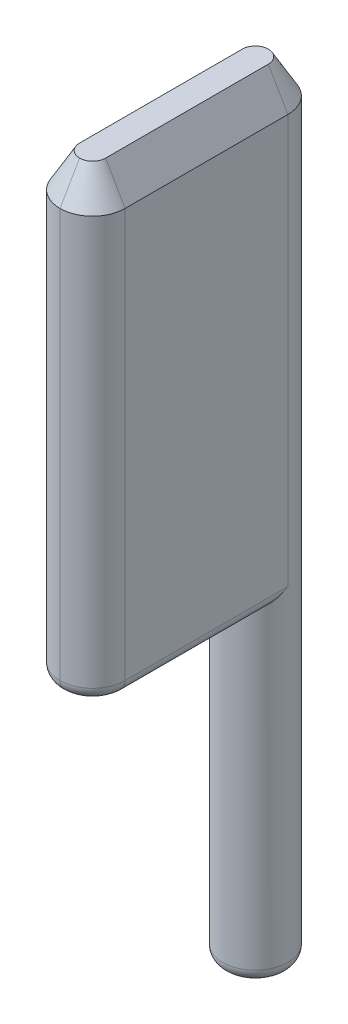
ISO-10303-21;
HEADER;
FILE_DESCRIPTION(('STEP AP214'),'2;1');
FILE_NAME('part.step','',(''),(''),'','','');
FILE_SCHEMA(('AUTOMOTIVE_DESIGN { 1 0 10303 214 1 1 1 1 }'));
ENDSEC;
DATA;
#1=APPLICATION_CONTEXT('core data for automotive mechanical design processes');
#2=APPLICATION_PROTOCOL_DEFINITION('international standard','automotive_design',2000,#1);
#3=PRODUCT_CONTEXT('',#1,'mechanical');
#4=PRODUCT('Part','Part','',(#3));
#5=PRODUCT_RELATED_PRODUCT_CATEGORY('part','',(#4));
#6=PRODUCT_DEFINITION_FORMATION('','',#4);
#7=PRODUCT_DEFINITION_CONTEXT('part definition',#1,'design');
#8=PRODUCT_DEFINITION('design','',#6,#7);
#9=PRODUCT_DEFINITION_SHAPE('','',#8);
#10=(LENGTH_UNIT() NAMED_UNIT(*) SI_UNIT(.MILLI.,.METRE.));
#11=(NAMED_UNIT(*) PLANE_ANGLE_UNIT() SI_UNIT($,.RADIAN.));
#12=(NAMED_UNIT(*) SI_UNIT($,.STERADIAN.) SOLID_ANGLE_UNIT());
#13=UNCERTAINTY_MEASURE_WITH_UNIT(LENGTH_MEASURE(1.E-05),#10,'distance_accuracy_value','');
#14=(GEOMETRIC_REPRESENTATION_CONTEXT(3) GLOBAL_UNCERTAINTY_ASSIGNED_CONTEXT((#13)) GLOBAL_UNIT_ASSIGNED_CONTEXT((#10,
#11,#12)) REPRESENTATION_CONTEXT('',''));
#15=CARTESIAN_POINT('',(0.,0.,0.));
#16=DIRECTION('',(0.,0.,1.));
#17=DIRECTION('',(1.,0.,0.));
#18=AXIS2_PLACEMENT_3D('',#15,#16,#17);
#19=CARTESIAN_POINT('',(0.,50.,0.));
#20=DIRECTION('',(0.,-1.,0.));
#21=DIRECTION('',(0.,0.,-1.));
#22=AXIS2_PLACEMENT_3D('',#19,#20,#21);
#23=CYLINDRICAL_SURFACE('',#22,5.);
#24=CARTESIAN_POINT('',(0.,2.,0.));
#25=DIRECTION('',(0.,1.,0.));
#26=DIRECTION('',(0.,0.,1.));
#27=AXIS2_PLACEMENT_3D('',#24,#25,#26);
#28=CIRCLE('',#27,5.);
#29=CARTESIAN_POINT('',(0.,2.,5.));
#30=VERTEX_POINT('',#29);
#31=EDGE_CURVE('E260',#30,#30,#28,.T.);
#32=ORIENTED_EDGE('',*,*,#31,.T.);
#33=EDGE_LOOP('',(#32));
#34=FACE_BOUND('',#33,.T.);
#35=DIRECTION('',(0.,-1.,0.));
#36=VECTOR('',#35,1.);
#37=CARTESIAN_POINT('',(-5.,120.,0.));
#38=LINE('',#37,#36);
#39=CARTESIAN_POINT('',(-5.,114.803847577293,0.));
#40=VERTEX_POINT('',#39);
#41=CARTESIAN_POINT('',(-5.,52.,0.));
#42=VERTEX_POINT('',#41);
#43=EDGE_CURVE('E151',#40,#42,#38,.T.);
#44=ORIENTED_EDGE('',*,*,#43,.F.);
#45=CARTESIAN_POINT('',(0.,114.803847577293,0.));
#46=DIRECTION('',(0.,-1.,0.));
#47=DIRECTION('',(0.,0.,-1.));
#48=AXIS2_PLACEMENT_3D('',#45,#46,#47);
#49=CIRCLE('',#48,5.);
#50=CARTESIAN_POINT('',(5.,114.803847577293,0.));
#51=VERTEX_POINT('',#50);
#52=EDGE_CURVE('E57',#40,#51,#49,.T.);
#53=ORIENTED_EDGE('',*,*,#52,.T.);
#54=DIRECTION('',(0.,-1.,0.));
#55=VECTOR('',#54,1.);
#56=CARTESIAN_POINT('',(5.,120.,0.));
#57=LINE('',#56,#55);
#58=CARTESIAN_POINT('',(5.,52.,0.));
#59=VERTEX_POINT('',#58);
#60=EDGE_CURVE('E168',#51,#59,#57,.T.);
#61=ORIENTED_EDGE('',*,*,#60,.T.);
#62=CARTESIAN_POINT('',(3.,50.,4.));
#63=CARTESIAN_POINT('',(3.06841415568073,50.0000067597266,3.94870806106206));
#64=CARTESIAN_POINT('',(3.13544178147233,50.0035084279663,3.89567780949558));
#65=CARTESIAN_POINT('',(3.26623698046415,50.0167109029042,3.78667268966545));
#66=CARTESIAN_POINT('',(3.33000998817647,50.0264009844002,3.7307030693738));
#67=CARTESIAN_POINT('',(3.45345849275947,50.0510771872825,3.6167152356291));
#68=CARTESIAN_POINT('',(3.51316717694485,50.0660120904686,3.5587215528404));
#69=CARTESIAN_POINT('',(3.62899797327076,50.1005222748414,3.44052676175929));
#70=CARTESIAN_POINT('',(3.6851179564377,50.1201002786803,3.38032437588784));
#71=CARTESIAN_POINT('',(3.81667715394249,50.1724441490579,3.23210856196807));
#72=CARTESIAN_POINT('',(3.89021381861328,50.2072814247064,3.14313020633906));
#73=CARTESIAN_POINT('',(4.02970569237115,50.2836005848064,2.96218509659868));
#74=CARTESIAN_POINT('',(4.09565901066883,50.325084120255,2.87021760449279));
#75=CARTESIAN_POINT('',(4.28302669874672,50.4581112195822,2.58967431946512));
#76=CARTESIAN_POINT('',(4.39316815051751,50.5578938926857,2.39735118917236));
#77=CARTESIAN_POINT('',(4.5567151501454,50.7402635992436,2.06399319131208));
#78=CARTESIAN_POINT('',(4.61729455445876,50.8193534892754,1.92439584496959));
#79=CARTESIAN_POINT('',(4.72477714964674,50.982793757942,1.6429135419546));
#80=CARTESIAN_POINT('',(4.77167431748921,51.0671464335245,1.50102760674192));
#81=CARTESIAN_POINT('',(4.85212411478638,51.2393114336602,1.21604872631644));
#82=CARTESIAN_POINT('',(4.88570430530138,51.3271161950798,1.07295890653981));
#83=CARTESIAN_POINT('',(4.94001426894181,51.5050321913334,0.785872581547716));
#84=CARTESIAN_POINT('',(4.96074815389477,51.5951426785276,0.641876381367767));
#85=CARTESIAN_POINT('',(4.99134748280353,51.787554785683,0.335925881978295));
#86=CARTESIAN_POINT('',(4.99959869260943,51.8900148896151,0.173902220000233));
#87=CARTESIAN_POINT('',(4.99999523540725,51.994960502319,0.00796814648684584));
#88=CARTESIAN_POINT('',(4.99999999704777,51.9974802675754,0.00398404784954047));
#89=CARTESIAN_POINT('',(5.,52.,0.));
#90=B_SPLINE_CURVE_WITH_KNOTS('',3,(#62,#63,#64,#65,#66,#67,#68,#69,#70,#71,#72,#73,#74,#75,#76,
#77,#78,#79,#80,#81,#82,#83,#84,#85,#86,#87,#88,#89),.UNSPECIFIED.,.F.,.F.,(4,2,2,2,2,2,2,2,2,2,
2,2,2,4),(0.,0.256323586120879,0.512204136350949,0.765652360303693,1.01924957198092,
1.38041574025909,1.74167176531567,2.46784096790537,2.9817850181479,3.49595497056345,
4.00905516339229,4.5219910388693,5.09684964624113,5.11099178908029),.UNSPECIFIED.);
#91=CARTESIAN_POINT('',(3.,50.,4.));
#92=VERTEX_POINT('',#91);
#93=EDGE_CURVE('E190',#59,#92,#90,.F.);
#94=ORIENTED_EDGE('',*,*,#93,.T.);
#95=CARTESIAN_POINT('',(0.,50.,0.));
#96=DIRECTION('',(0.,1.,0.));
#97=DIRECTION('',(0.,0.,1.));
#98=AXIS2_PLACEMENT_3D('',#95,#96,#97);
#99=CIRCLE('',#98,5.);
#100=CARTESIAN_POINT('',(-3.,50.,4.));
#101=VERTEX_POINT('',#100);
#102=EDGE_CURVE('E160',#101,#92,#99,.T.);
#103=ORIENTED_EDGE('',*,*,#102,.F.);
#104=CARTESIAN_POINT('',(-3.,50.,4.));
#105=CARTESIAN_POINT('',(-3.06841415568073,50.0000067597266,3.94870806106206));
#106=CARTESIAN_POINT('',(-3.13544178147233,50.0035084279663,3.89567780949558));
#107=CARTESIAN_POINT('',(-3.26623698046415,50.0167109029042,3.78667268966545));
#108=CARTESIAN_POINT('',(-3.33000998817647,50.0264009844002,3.7307030693738));
#109=CARTESIAN_POINT('',(-3.45345849275947,50.0510771872825,3.6167152356291));
#110=CARTESIAN_POINT('',(-3.51316717694485,50.0660120904686,3.5587215528404));
#111=CARTESIAN_POINT('',(-3.62899797327076,50.1005222748414,3.44052676175929));
#112=CARTESIAN_POINT('',(-3.6851179564377,50.1201002786803,3.38032437588784));
#113=CARTESIAN_POINT('',(-3.81667715394248,50.1724441490579,3.23210856196807));
#114=CARTESIAN_POINT('',(-3.89021381861328,50.2072814247064,3.14313020633906));
#115=CARTESIAN_POINT('',(-4.02970569237115,50.2836005848064,2.96218509659868));
#116=CARTESIAN_POINT('',(-4.09565901066883,50.325084120255,2.87021760449279));
#117=CARTESIAN_POINT('',(-4.28302669874672,50.4581112195822,2.58967431946512));
#118=CARTESIAN_POINT('',(-4.39316815051751,50.5578938926857,2.39735118917236));
#119=CARTESIAN_POINT('',(-4.5567151501454,50.7402635992436,2.06399319131208));
#120=CARTESIAN_POINT('',(-4.61729455445876,50.8193534892754,1.9243958449696));
#121=CARTESIAN_POINT('',(-4.72477714964674,50.982793757942,1.6429135419546));
#122=CARTESIAN_POINT('',(-4.77167431748921,51.0671464335245,1.50102760674192));
#123=CARTESIAN_POINT('',(-4.85212411478637,51.2393114336602,1.21604872631645));
#124=CARTESIAN_POINT('',(-4.88570430530138,51.3271161950798,1.07295890653981));
#125=CARTESIAN_POINT('',(-4.9400142689418,51.5050321913334,0.785872581547719));
#126=CARTESIAN_POINT('',(-4.96074815389477,51.5951426785276,0.641876381367769));
#127=CARTESIAN_POINT('',(-4.99134748280353,51.787554785683,0.335925881978296));
#128=CARTESIAN_POINT('',(-4.99959869260943,51.8900148896151,0.173902220000234));
#129=CARTESIAN_POINT('',(-4.99999523540725,51.994960502319,0.00796814648684652));
#130=CARTESIAN_POINT('',(-4.99999999704777,51.9974802675754,0.00398404784954117));
#131=CARTESIAN_POINT('',(-5.,52.,0.));
#132=B_SPLINE_CURVE_WITH_KNOTS('',3,(#104,#105,#106,#107,#108,#109,#110,#111,#112,#113,#114,
#115,#116,#117,#118,#119,#120,#121,#122,#123,#124,#125,#126,#127,#128,#129,#130,#131),
.UNSPECIFIED.,.F.,.F.,(4,2,2,2,2,2,2,2,2,2,2,2,2,4),(0.,0.256323586120879,0.512204136350949,
0.765652360303691,1.01924957198092,1.38041574025909,1.74167176531566,2.46784096790537,
2.9817850181479,3.49595497056344,4.00905516339228,4.5219910388693,5.09684964624113,
5.11099178908029),.UNSPECIFIED.);
#133=EDGE_CURVE('E182',#101,#42,#132,.T.);
#134=ORIENTED_EDGE('',*,*,#133,.T.);
#135=EDGE_LOOP('',(#44,#53,#61,#94,#103,#134));
#136=FACE_BOUND('',#135,.T.);
#137=ADVANCED_FACE('F47',(#34,#136),#23,.T.);
#138=CARTESIAN_POINT('',(0.,0.,0.));
#139=DIRECTION('',(0.,1.,0.));
#140=DIRECTION('',(0.,0.,1.));
#141=AXIS2_PLACEMENT_3D('',#138,#139,#140);
#142=PLANE('',#141);
#143=CARTESIAN_POINT('',(0.,0.,0.));
#144=DIRECTION('',(0.,1.,0.));
#145=DIRECTION('',(0.,0.,1.));
#146=AXIS2_PLACEMENT_3D('',#143,#144,#145);
#147=CIRCLE('',#146,3.);
#148=CARTESIAN_POINT('',(0.,0.,3.));
#149=VERTEX_POINT('',#148);
#150=EDGE_CURVE('E295',#149,#149,#147,.F.);
#151=ORIENTED_EDGE('',*,*,#150,.T.);
#152=EDGE_LOOP('',(#151));
#153=FACE_BOUND('',#152,.T.);
#154=ADVANCED_FACE('F250',(#153),#142,.F.);
#155=CARTESIAN_POINT('',(-5.,120.,0.));
#156=DIRECTION('',(1.,0.,0.));
#157=DIRECTION('',(0.,0.,-1.));
#158=AXIS2_PLACEMENT_3D('',#155,#156,#157);
#159=PLANE('',#158);
#160=DIRECTION('',(0.,-1.,0.));
#161=VECTOR('',#160,1.);
#162=CARTESIAN_POINT('',(-5.,120.,25.));
#163=LINE('',#162,#161);
#164=CARTESIAN_POINT('',(-5.,52.,25.));
#165=VERTEX_POINT('',#164);
#166=CARTESIAN_POINT('',(-5.,114.803847577293,25.));
#167=VERTEX_POINT('',#166);
#168=EDGE_CURVE('E150',#165,#167,#163,.F.);
#169=ORIENTED_EDGE('',*,*,#168,.T.);
#170=DIRECTION('',(0.,0.,-1.));
#171=VECTOR('',#170,1.);
#172=CARTESIAN_POINT('',(-5.,114.803847577293,0.));
#173=LINE('',#172,#171);
#174=EDGE_CURVE('E272',#167,#40,#173,.T.);
#175=ORIENTED_EDGE('',*,*,#174,.T.);
#176=ORIENTED_EDGE('',*,*,#43,.T.);
#177=DIRECTION('',(0.,0.,1.));
#178=VECTOR('',#177,1.);
#179=CARTESIAN_POINT('',(-5.,52.,25.));
#180=LINE('',#179,#178);
#181=EDGE_CURVE('E131',#42,#165,#180,.T.);
#182=ORIENTED_EDGE('',*,*,#181,.T.);
#183=EDGE_LOOP('',(#169,#175,#176,#182));
#184=FACE_BOUND('',#183,.T.);
#185=ADVANCED_FACE('F149',(#184),#159,.F.);
#186=CARTESIAN_POINT('',(5.,120.,30.));
#187=DIRECTION('',(-1.,0.,0.));
#188=DIRECTION('',(0.,0.,1.));
#189=AXIS2_PLACEMENT_3D('',#186,#187,#188);
#190=PLANE('',#189);
#191=ORIENTED_EDGE('',*,*,#60,.F.);
#192=DIRECTION('',(0.,0.,1.));
#193=VECTOR('',#192,1.);
#194=CARTESIAN_POINT('',(5.,114.803847577293,30.));
#195=LINE('',#194,#193);
#196=CARTESIAN_POINT('',(5.,114.803847577293,25.));
#197=VERTEX_POINT('',#196);
#198=EDGE_CURVE('E11',#51,#197,#195,.T.);
#199=ORIENTED_EDGE('',*,*,#198,.T.);
#200=DIRECTION('',(0.,-1.,0.));
#201=VECTOR('',#200,1.);
#202=CARTESIAN_POINT('',(5.,120.,25.));
#203=LINE('',#202,#201);
#204=CARTESIAN_POINT('',(5.,52.,25.));
#205=VERTEX_POINT('',#204);
#206=EDGE_CURVE('E154',#197,#205,#203,.T.);
#207=ORIENTED_EDGE('',*,*,#206,.T.);
#208=DIRECTION('',(0.,0.,-1.));
#209=VECTOR('',#208,1.);
#210=CARTESIAN_POINT('',(5.,52.,0.));
#211=LINE('',#210,#209);
#212=EDGE_CURVE('E179',#205,#59,#211,.T.);
#213=ORIENTED_EDGE('',*,*,#212,.T.);
#214=EDGE_LOOP('',(#191,#199,#207,#213));
#215=FACE_BOUND('',#214,.T.);
#216=ADVANCED_FACE('F307',(#215),#190,.F.);
#217=CARTESIAN_POINT('',(0.,120.,0.));
#218=DIRECTION('',(0.,-1.,0.));
#219=DIRECTION('',(0.,0.,-1.));
#220=AXIS2_PLACEMENT_3D('',#217,#218,#219);
#221=PLANE('',#220);
#222=DIRECTION('',(0.,0.,1.));
#223=VECTOR('',#222,1.);
#224=CARTESIAN_POINT('',(-2.,120.,0.));
#225=LINE('',#224,#223);
#226=CARTESIAN_POINT('',(-2.,120.,0.));
#227=VERTEX_POINT('',#226);
#228=CARTESIAN_POINT('',(-1.99999999999999,120.,25.));
#229=VERTEX_POINT('',#228);
#230=EDGE_CURVE('E273',#227,#229,#225,.T.);
#231=ORIENTED_EDGE('',*,*,#230,.T.);
#232=CARTESIAN_POINT('',(0.,120.,25.));
#233=DIRECTION('',(0.,-1.,0.));
#234=DIRECTION('',(0.,0.,-1.));
#235=AXIS2_PLACEMENT_3D('',#232,#233,#234);
#236=CIRCLE('',#235,2.);
#237=CARTESIAN_POINT('',(0.,120.,27.));
#238=VERTEX_POINT('',#237);
#239=EDGE_CURVE('E285',#229,#238,#236,.F.);
#240=ORIENTED_EDGE('',*,*,#239,.T.);
#241=CARTESIAN_POINT('',(0.,120.,25.));
#242=DIRECTION('',(0.,-1.,0.));
#243=DIRECTION('',(0.,0.,-1.));
#244=AXIS2_PLACEMENT_3D('',#241,#242,#243);
#245=CIRCLE('',#244,2.);
#246=CARTESIAN_POINT('',(2.,120.,25.));
#247=VERTEX_POINT('',#246);
#248=EDGE_CURVE('E289',#238,#247,#245,.F.);
#249=ORIENTED_EDGE('',*,*,#248,.T.);
#250=DIRECTION('',(0.,0.,-1.));
#251=VECTOR('',#250,1.);
#252=CARTESIAN_POINT('',(2.,120.,0.));
#253=LINE('',#252,#251);
#254=CARTESIAN_POINT('',(2.,120.,0.));
#255=VERTEX_POINT('',#254);
#256=EDGE_CURVE('E293',#247,#255,#253,.T.);
#257=ORIENTED_EDGE('',*,*,#256,.T.);
#258=CARTESIAN_POINT('',(0.,120.,0.));
#259=DIRECTION('',(0.,-1.,0.));
#260=DIRECTION('',(0.,0.,-1.));
#261=AXIS2_PLACEMENT_3D('',#258,#259,#260);
#262=CIRCLE('',#261,2.);
#263=EDGE_CURVE('E291',#255,#227,#262,.F.);
#264=ORIENTED_EDGE('',*,*,#263,.T.);
#265=EDGE_LOOP('',(#231,#240,#249,#257,#264));
#266=FACE_BOUND('',#265,.T.);
#267=ADVANCED_FACE('F316',(#266),#221,.F.);
#268=CARTESIAN_POINT('',(0.,50.,0.));
#269=DIRECTION('',(0.,-1.,0.));
#270=DIRECTION('',(0.,0.,-1.));
#271=AXIS2_PLACEMENT_3D('',#268,#269,#270);
#272=PLANE('',#271);
#273=CARTESIAN_POINT('',(0.,50.,25.));
#274=DIRECTION('',(0.,-1.,0.));
#275=DIRECTION('',(0.,0.,-1.));
#276=AXIS2_PLACEMENT_3D('',#273,#274,#275);
#277=CIRCLE('',#276,3.);
#278=CARTESIAN_POINT('',(0.,50.,28.));
#279=VERTEX_POINT('',#278);
#280=CARTESIAN_POINT('',(-3.,50.,25.));
#281=VERTEX_POINT('',#280);
#282=EDGE_CURVE('E174',#279,#281,#277,.T.);
#283=ORIENTED_EDGE('',*,*,#282,.T.);
#284=DIRECTION('',(0.,0.,1.));
#285=VECTOR('',#284,1.);
#286=CARTESIAN_POINT('',(-3.,50.,0.));
#287=LINE('',#286,#285);
#288=EDGE_CURVE('E132',#281,#101,#287,.F.);
#289=ORIENTED_EDGE('',*,*,#288,.T.);
#290=ORIENTED_EDGE('',*,*,#102,.T.);
#291=DIRECTION('',(0.,0.,-1.));
#292=VECTOR('',#291,1.);
#293=CARTESIAN_POINT('',(3.,50.,25.));
#294=LINE('',#293,#292);
#295=CARTESIAN_POINT('',(3.,50.,25.));
#296=VERTEX_POINT('',#295);
#297=EDGE_CURVE('E153',#92,#296,#294,.F.);
#298=ORIENTED_EDGE('',*,*,#297,.T.);
#299=CARTESIAN_POINT('',(0.,50.,25.));
#300=DIRECTION('',(0.,-1.,0.));
#301=DIRECTION('',(0.,0.,-1.));
#302=AXIS2_PLACEMENT_3D('',#299,#300,#301);
#303=CIRCLE('',#302,3.);
#304=EDGE_CURVE('E172',#296,#279,#303,.T.);
#305=ORIENTED_EDGE('',*,*,#304,.T.);
#306=EDGE_LOOP('',(#283,#289,#290,#298,#305));
#307=FACE_BOUND('',#306,.T.);
#308=ADVANCED_FACE('F318',(#307),#272,.T.);
#309=CARTESIAN_POINT('',(0.,120.,25.));
#310=DIRECTION('',(0.,-1.,0.));
#311=DIRECTION('',(0.,0.,-1.));
#312=AXIS2_PLACEMENT_3D('',#309,#310,#311);
#313=CYLINDRICAL_SURFACE('',#312,5.);
#314=ORIENTED_EDGE('',*,*,#206,.F.);
#315=CARTESIAN_POINT('',(0.,114.803847577293,25.));
#316=DIRECTION('',(0.,-1.,0.));
#317=DIRECTION('',(0.,0.,-1.));
#318=AXIS2_PLACEMENT_3D('',#315,#316,#317);
#319=CIRCLE('',#318,5.);
#320=CARTESIAN_POINT('',(0.,114.803847577293,30.));
#321=VERTEX_POINT('',#320);
#322=EDGE_CURVE('E268',#197,#321,#319,.T.);
#323=ORIENTED_EDGE('',*,*,#322,.T.);
#324=DIRECTION('',(0.,-1.,0.));
#325=VECTOR('',#324,1.);
#326=CARTESIAN_POINT('',(0.,120.,30.));
#327=LINE('',#326,#325);
#328=CARTESIAN_POINT('',(0.,52.,30.));
#329=VERTEX_POINT('',#328);
#330=EDGE_CURVE('E167',#329,#321,#327,.F.);
#331=ORIENTED_EDGE('',*,*,#330,.F.);
#332=CARTESIAN_POINT('',(0.,52.,25.));
#333=DIRECTION('',(0.,-1.,0.));
#334=DIRECTION('',(0.,0.,-1.));
#335=AXIS2_PLACEMENT_3D('',#332,#333,#334);
#336=CIRCLE('',#335,5.);
#337=EDGE_CURVE('E145',#329,#205,#336,.F.);
#338=ORIENTED_EDGE('',*,*,#337,.T.);
#339=EDGE_LOOP('',(#314,#323,#331,#338));
#340=FACE_BOUND('',#339,.T.);
#341=ADVANCED_FACE('F204',(#340),#313,.T.);
#342=CARTESIAN_POINT('',(0.,120.,25.));
#343=DIRECTION('',(0.,-1.,0.));
#344=DIRECTION('',(0.,0.,-1.));
#345=AXIS2_PLACEMENT_3D('',#342,#343,#344);
#346=CYLINDRICAL_SURFACE('',#345,5.);
#347=ORIENTED_EDGE('',*,*,#330,.T.);
#348=CARTESIAN_POINT('',(0.,114.803847577293,25.));
#349=DIRECTION('',(0.,-1.,0.));
#350=DIRECTION('',(0.,0.,-1.));
#351=AXIS2_PLACEMENT_3D('',#348,#349,#350);
#352=CIRCLE('',#351,5.);
#353=EDGE_CURVE('E159',#321,#167,#352,.T.);
#354=ORIENTED_EDGE('',*,*,#353,.T.);
#355=ORIENTED_EDGE('',*,*,#168,.F.);
#356=CARTESIAN_POINT('',(0.,52.,25.));
#357=DIRECTION('',(0.,-1.,0.));
#358=DIRECTION('',(0.,0.,-1.));
#359=AXIS2_PLACEMENT_3D('',#356,#357,#358);
#360=CIRCLE('',#359,5.);
#361=EDGE_CURVE('E138',#165,#329,#360,.F.);
#362=ORIENTED_EDGE('',*,*,#361,.T.);
#363=EDGE_LOOP('',(#347,#354,#355,#362));
#364=FACE_BOUND('',#363,.T.);
#365=ADVANCED_FACE('F157',(#364),#346,.T.);
#366=CARTESIAN_POINT('',(3.,52.,30.));
#367=DIRECTION('',(0.,0.,1.));
#368=DIRECTION('',(1.,0.,0.));
#369=AXIS2_PLACEMENT_3D('',#366,#367,#368);
#370=CYLINDRICAL_SURFACE('',#369,2.);
#371=ORIENTED_EDGE('',*,*,#93,.F.);
#372=ORIENTED_EDGE('',*,*,#212,.F.);
#373=CARTESIAN_POINT('',(3.,52.,25.));
#374=DIRECTION('',(0.,0.,1.));
#375=DIRECTION('',(1.,0.,0.));
#376=AXIS2_PLACEMENT_3D('',#373,#374,#375);
#377=CIRCLE('',#376,2.);
#378=EDGE_CURVE('E169',#296,#205,#377,.T.);
#379=ORIENTED_EDGE('',*,*,#378,.F.);
#380=ORIENTED_EDGE('',*,*,#297,.F.);
#381=EDGE_LOOP('',(#371,#372,#379,#380));
#382=FACE_BOUND('',#381,.T.);
#383=ADVANCED_FACE('F209',(#382),#370,.T.);
#384=CARTESIAN_POINT('',(0.,52.,25.));
#385=DIRECTION('',(0.,-1.,0.));
#386=DIRECTION('',(0.,0.,-1.));
#387=AXIS2_PLACEMENT_3D('',#384,#385,#386);
#388=TOROIDAL_SURFACE('',#387,3.,2.);
#389=ORIENTED_EDGE('',*,*,#378,.T.);
#390=ORIENTED_EDGE('',*,*,#337,.F.);
#391=CARTESIAN_POINT('',(0.,52.,28.));
#392=DIRECTION('',(-1.,0.,0.));
#393=DIRECTION('',(0.,0.,1.));
#394=AXIS2_PLACEMENT_3D('',#391,#392,#393);
#395=CIRCLE('',#394,2.);
#396=EDGE_CURVE('E135',#279,#329,#395,.T.);
#397=ORIENTED_EDGE('',*,*,#396,.F.);
#398=ORIENTED_EDGE('',*,*,#304,.F.);
#399=EDGE_LOOP('',(#389,#390,#397,#398));
#400=FACE_BOUND('',#399,.T.);
#401=ADVANCED_FACE('F207',(#400),#388,.T.);
#402=CARTESIAN_POINT('',(0.,52.,25.));
#403=DIRECTION('',(0.,-1.,0.));
#404=DIRECTION('',(0.,0.,-1.));
#405=AXIS2_PLACEMENT_3D('',#402,#403,#404);
#406=TOROIDAL_SURFACE('',#405,3.,2.);
#407=ORIENTED_EDGE('',*,*,#396,.T.);
#408=ORIENTED_EDGE('',*,*,#361,.F.);
#409=CARTESIAN_POINT('',(-3.,52.,25.));
#410=DIRECTION('',(0.,0.,-1.));
#411=DIRECTION('',(-1.,0.,0.));
#412=AXIS2_PLACEMENT_3D('',#409,#410,#411);
#413=CIRCLE('',#412,2.);
#414=EDGE_CURVE('E126',#281,#165,#413,.T.);
#415=ORIENTED_EDGE('',*,*,#414,.F.);
#416=ORIENTED_EDGE('',*,*,#282,.F.);
#417=EDGE_LOOP('',(#407,#408,#415,#416));
#418=FACE_BOUND('',#417,.T.);
#419=ADVANCED_FACE('F139',(#418),#406,.T.);
#420=CARTESIAN_POINT('',(-3.,52.,0.));
#421=DIRECTION('',(0.,0.,-1.));
#422=DIRECTION('',(-1.,0.,0.));
#423=AXIS2_PLACEMENT_3D('',#420,#421,#422);
#424=CYLINDRICAL_SURFACE('',#423,2.);
#425=ORIENTED_EDGE('',*,*,#133,.F.);
#426=ORIENTED_EDGE('',*,*,#288,.F.);
#427=ORIENTED_EDGE('',*,*,#414,.T.);
#428=ORIENTED_EDGE('',*,*,#181,.F.);
#429=EDGE_LOOP('',(#425,#426,#427,#428));
#430=FACE_BOUND('',#429,.T.);
#431=ADVANCED_FACE('F129',(#430),#424,.T.);
#432=CARTESIAN_POINT('',(0.,2.,0.));
#433=DIRECTION('',(0.,1.,0.));
#434=DIRECTION('',(0.,0.,1.));
#435=AXIS2_PLACEMENT_3D('',#432,#433,#434);
#436=TOROIDAL_SURFACE('',#435,3.,2.);
#437=ORIENTED_EDGE('',*,*,#150,.F.);
#438=EDGE_LOOP('',(#437));
#439=FACE_BOUND('',#438,.T.);
#440=ORIENTED_EDGE('',*,*,#31,.F.);
#441=EDGE_LOOP('',(#440));
#442=FACE_BOUND('',#441,.T.);
#443=ADVANCED_FACE('F203',(#439,#442),#436,.T.);
#444=CARTESIAN_POINT('',(0.,120.,0.));
#445=DIRECTION('',(0.,-1.,0.));
#446=DIRECTION('',(0.,0.,-1.));
#447=AXIS2_PLACEMENT_3D('',#444,#445,#446);
#448=CONICAL_SURFACE('',#447,2.,0.523598775598302);
#449=DIRECTION('',(-0.500000000000003,-0.866025403784437,0.));
#450=VECTOR('',#449,1.);
#451=CARTESIAN_POINT('',(-2.,120.,0.));
#452=LINE('',#451,#450);
#453=EDGE_CURVE('E266',#227,#40,#452,.T.);
#454=ORIENTED_EDGE('',*,*,#453,.F.);
#455=ORIENTED_EDGE('',*,*,#263,.F.);
#456=DIRECTION('',(-0.500000000000003,0.866025403784437,0.));
#457=VECTOR('',#456,1.);
#458=CARTESIAN_POINT('',(5.,114.803847577293,0.));
#459=LINE('',#458,#457);
#460=EDGE_CURVE('E52',#51,#255,#459,.T.);
#461=ORIENTED_EDGE('',*,*,#460,.F.);
#462=ORIENTED_EDGE('',*,*,#52,.F.);
#463=EDGE_LOOP('',(#454,#455,#461,#462));
#464=FACE_BOUND('',#463,.T.);
#465=ADVANCED_FACE('F50',(#464),#448,.T.);
#466=CARTESIAN_POINT('',(2.,120.,0.));
#467=DIRECTION('',(-0.866025403784437,-0.500000000000003,0.));
#468=DIRECTION('',(0.,0.,-1.));
#469=AXIS2_PLACEMENT_3D('',#466,#467,#468);
#470=PLANE('',#469);
#471=ORIENTED_EDGE('',*,*,#460,.T.);
#472=ORIENTED_EDGE('',*,*,#256,.F.);
#473=DIRECTION('',(-0.500000000000003,0.866025403784437,0.));
#474=VECTOR('',#473,1.);
#475=CARTESIAN_POINT('',(5.,114.803847577293,25.));
#476=LINE('',#475,#474);
#477=EDGE_CURVE('E274',#197,#247,#476,.T.);
#478=ORIENTED_EDGE('',*,*,#477,.F.);
#479=ORIENTED_EDGE('',*,*,#198,.F.);
#480=EDGE_LOOP('',(#471,#472,#478,#479));
#481=FACE_BOUND('',#480,.T.);
#482=ADVANCED_FACE('F238',(#481),#470,.F.);
#483=CARTESIAN_POINT('',(-2.,120.,0.));
#484=DIRECTION('',(0.866025403784437,-0.500000000000003,0.));
#485=DIRECTION('',(0.,0.,1.));
#486=AXIS2_PLACEMENT_3D('',#483,#484,#485);
#487=PLANE('',#486);
#488=ORIENTED_EDGE('',*,*,#453,.T.);
#489=ORIENTED_EDGE('',*,*,#174,.F.);
#490=DIRECTION('',(-0.500000000000003,-0.866025403784437,0.));
#491=VECTOR('',#490,1.);
#492=CARTESIAN_POINT('',(-1.99999999999999,120.,25.));
#493=LINE('',#492,#491);
#494=EDGE_CURVE('E276',#229,#167,#493,.T.);
#495=ORIENTED_EDGE('',*,*,#494,.F.);
#496=ORIENTED_EDGE('',*,*,#230,.F.);
#497=EDGE_LOOP('',(#488,#489,#495,#496));
#498=FACE_BOUND('',#497,.T.);
#499=ADVANCED_FACE('F232',(#498),#487,.F.);
#500=CARTESIAN_POINT('',(0.,120.,25.));
#501=DIRECTION('',(0.,-1.,0.));
#502=DIRECTION('',(0.,0.,-1.));
#503=AXIS2_PLACEMENT_3D('',#500,#501,#502);
#504=CONICAL_SURFACE('',#503,2.,0.523598775598302);
#505=ORIENTED_EDGE('',*,*,#477,.T.);
#506=ORIENTED_EDGE('',*,*,#248,.F.);
#507=DIRECTION('',(0.,0.866025403784437,-0.500000000000003));
#508=VECTOR('',#507,1.);
#509=CARTESIAN_POINT('',(0.,114.803847577293,30.));
#510=LINE('',#509,#508);
#511=EDGE_CURVE('E280',#321,#238,#510,.T.);
#512=ORIENTED_EDGE('',*,*,#511,.F.);
#513=ORIENTED_EDGE('',*,*,#322,.F.);
#514=EDGE_LOOP('',(#505,#506,#512,#513));
#515=FACE_BOUND('',#514,.T.);
#516=ADVANCED_FACE('F225',(#515),#504,.T.);
#517=CARTESIAN_POINT('',(0.,120.,25.));
#518=DIRECTION('',(0.,-1.,0.));
#519=DIRECTION('',(0.,0.,-1.));
#520=AXIS2_PLACEMENT_3D('',#517,#518,#519);
#521=CONICAL_SURFACE('',#520,2.,0.523598775598302);
#522=ORIENTED_EDGE('',*,*,#494,.T.);
#523=ORIENTED_EDGE('',*,*,#353,.F.);
#524=ORIENTED_EDGE('',*,*,#511,.T.);
#525=ORIENTED_EDGE('',*,*,#239,.F.);
#526=EDGE_LOOP('',(#522,#523,#524,#525));
#527=FACE_BOUND('',#526,.T.);
#528=ADVANCED_FACE('F219',(#527),#521,.T.);
#529=CLOSED_SHELL('',(#137,#154,#185,#216,#267,#308,#341,#365,#383,#401,#419,#431,#443,#465,
#482,#499,#516,#528));
#530=MANIFOLD_SOLID_BREP('B2',#529);
#531=ADVANCED_BREP_SHAPE_REPRESENTATION('',(#18,#530),#14);
#532=SHAPE_DEFINITION_REPRESENTATION(#9,#531);
ENDSEC;
END-ISO-10303-21;
